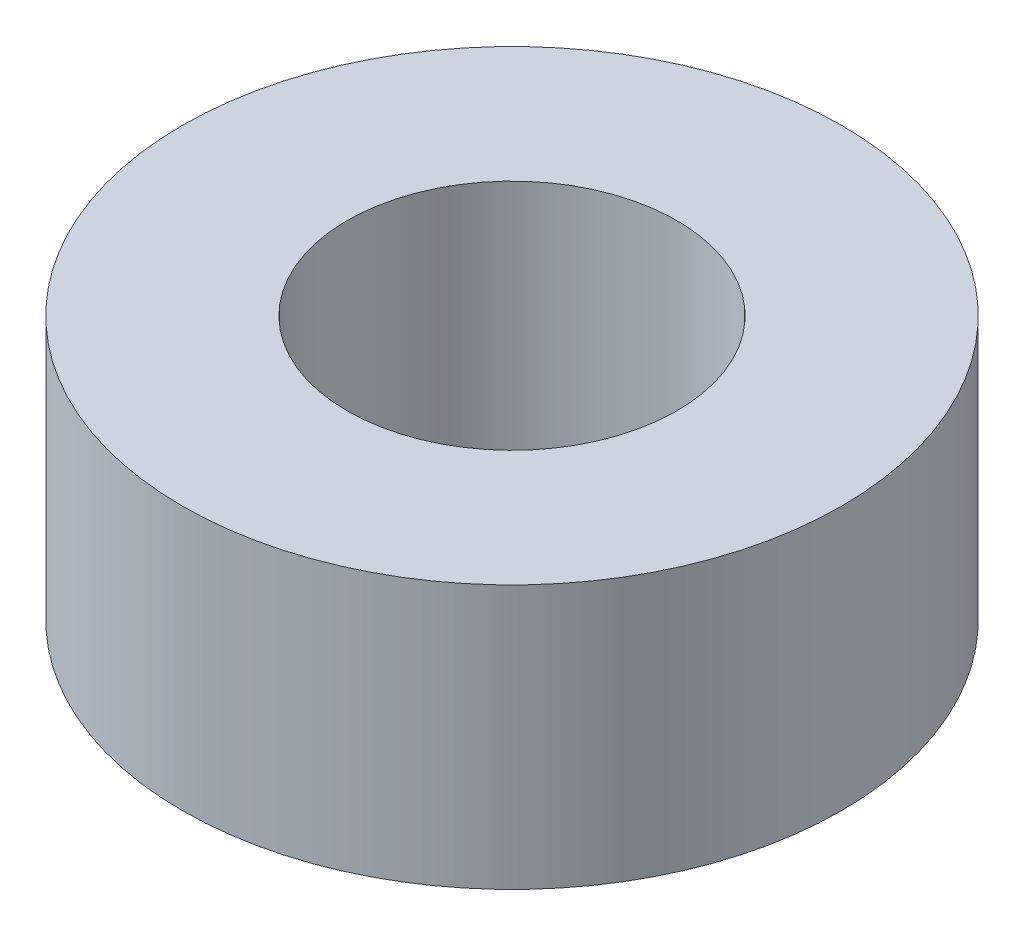
ISO-10303-21;
HEADER;
FILE_DESCRIPTION(('STEP AP214'),'2;1');
FILE_NAME('part.step','',(''),(''),'','','');
FILE_SCHEMA(('AUTOMOTIVE_DESIGN { 1 0 10303 214 1 1 1 1 }'));
ENDSEC;
DATA;
#1=APPLICATION_CONTEXT('core data for automotive mechanical design processes');
#2=APPLICATION_PROTOCOL_DEFINITION('international standard','automotive_design',2000,#1);
#3=PRODUCT_CONTEXT('',#1,'mechanical');
#4=PRODUCT('Part','Part','',(#3));
#5=PRODUCT_RELATED_PRODUCT_CATEGORY('part','',(#4));
#6=PRODUCT_DEFINITION_FORMATION('','',#4);
#7=PRODUCT_DEFINITION_CONTEXT('part definition',#1,'design');
#8=PRODUCT_DEFINITION('design','',#6,#7);
#9=PRODUCT_DEFINITION_SHAPE('','',#8);
#10=(LENGTH_UNIT() NAMED_UNIT(*) SI_UNIT(.MILLI.,.METRE.));
#11=(NAMED_UNIT(*) PLANE_ANGLE_UNIT() SI_UNIT($,.RADIAN.));
#12=(NAMED_UNIT(*) SI_UNIT($,.STERADIAN.) SOLID_ANGLE_UNIT());
#13=UNCERTAINTY_MEASURE_WITH_UNIT(LENGTH_MEASURE(1.E-05),#10,'distance_accuracy_value','');
#14=(GEOMETRIC_REPRESENTATION_CONTEXT(3) GLOBAL_UNCERTAINTY_ASSIGNED_CONTEXT((#13)) GLOBAL_UNIT_ASSIGNED_CONTEXT((#10,
#11,#12)) REPRESENTATION_CONTEXT('',''));
#15=CARTESIAN_POINT('',(0.,0.,0.));
#16=DIRECTION('',(0.,0.,1.));
#17=DIRECTION('',(1.,0.,0.));
#18=AXIS2_PLACEMENT_3D('',#15,#16,#17);
#19=CARTESIAN_POINT('',(0.,4.,0.));
#20=DIRECTION('',(0.,1.,0.));
#21=DIRECTION('',(0.,0.,1.));
#22=AXIS2_PLACEMENT_3D('',#19,#20,#21);
#23=PLANE('',#22);
#24=CARTESIAN_POINT('',(0.,4.,0.));
#25=DIRECTION('',(0.,1.,0.));
#26=DIRECTION('',(0.,0.,1.));
#27=AXIS2_PLACEMENT_3D('',#24,#25,#26);
#28=CIRCLE('',#27,5.);
#29=CARTESIAN_POINT('',(0.,4.,5.));
#30=VERTEX_POINT('',#29);
#31=EDGE_CURVE('E10',#30,#30,#28,.T.);
#32=ORIENTED_EDGE('',*,*,#31,.T.);
#33=EDGE_LOOP('',(#32));
#34=FACE_BOUND('',#33,.T.);
#35=CARTESIAN_POINT('',(0.,4.,0.));
#36=DIRECTION('',(0.,1.,0.));
#37=DIRECTION('',(0.,0.,1.));
#38=AXIS2_PLACEMENT_3D('',#35,#36,#37);
#39=CIRCLE('',#38,2.5);
#40=CARTESIAN_POINT('',(0.,4.,2.5));
#41=VERTEX_POINT('',#40);
#42=EDGE_CURVE('E44',#41,#41,#39,.T.);
#43=ORIENTED_EDGE('',*,*,#42,.F.);
#44=EDGE_LOOP('',(#43));
#45=FACE_BOUND('',#44,.T.);
#46=ADVANCED_FACE('F33',(#34,#45),#23,.T.);
#47=CARTESIAN_POINT('',(0.,0.,0.));
#48=DIRECTION('',(0.,1.,0.));
#49=DIRECTION('',(0.,0.,1.));
#50=AXIS2_PLACEMENT_3D('',#47,#48,#49);
#51=PLANE('',#50);
#52=CARTESIAN_POINT('',(0.,0.,0.));
#53=DIRECTION('',(0.,1.,0.));
#54=DIRECTION('',(0.,0.,1.));
#55=AXIS2_PLACEMENT_3D('',#52,#53,#54);
#56=CIRCLE('',#55,5.);
#57=CARTESIAN_POINT('',(0.,0.,5.));
#58=VERTEX_POINT('',#57);
#59=EDGE_CURVE('E37',#58,#58,#56,.T.);
#60=ORIENTED_EDGE('',*,*,#59,.F.);
#61=EDGE_LOOP('',(#60));
#62=FACE_BOUND('',#61,.T.);
#63=CARTESIAN_POINT('',(0.,0.,0.));
#64=DIRECTION('',(0.,1.,0.));
#65=DIRECTION('',(0.,0.,1.));
#66=AXIS2_PLACEMENT_3D('',#63,#64,#65);
#67=CIRCLE('',#66,2.5);
#68=CARTESIAN_POINT('',(0.,0.,2.5));
#69=VERTEX_POINT('',#68);
#70=EDGE_CURVE('E46',#69,#69,#67,.T.);
#71=ORIENTED_EDGE('',*,*,#70,.T.);
#72=EDGE_LOOP('',(#71));
#73=FACE_BOUND('',#72,.T.);
#74=ADVANCED_FACE('F56',(#62,#73),#51,.F.);
#75=CARTESIAN_POINT('',(0.,4.,0.));
#76=DIRECTION('',(0.,-1.,0.));
#77=DIRECTION('',(0.,0.,-1.));
#78=AXIS2_PLACEMENT_3D('',#75,#76,#77);
#79=CYLINDRICAL_SURFACE('',#78,5.);
#80=ORIENTED_EDGE('',*,*,#31,.F.);
#81=EDGE_LOOP('',(#80));
#82=FACE_BOUND('',#81,.T.);
#83=ORIENTED_EDGE('',*,*,#59,.T.);
#84=EDGE_LOOP('',(#83));
#85=FACE_BOUND('',#84,.T.);
#86=ADVANCED_FACE('F35',(#82,#85),#79,.T.);
#87=CARTESIAN_POINT('',(0.,4.,0.));
#88=DIRECTION('',(0.,-1.,0.));
#89=DIRECTION('',(0.,0.,-1.));
#90=AXIS2_PLACEMENT_3D('',#87,#88,#89);
#91=CYLINDRICAL_SURFACE('',#90,2.5);
#92=ORIENTED_EDGE('',*,*,#42,.T.);
#93=EDGE_LOOP('',(#92));
#94=FACE_BOUND('',#93,.T.);
#95=ORIENTED_EDGE('',*,*,#70,.F.);
#96=EDGE_LOOP('',(#95));
#97=FACE_BOUND('',#96,.T.);
#98=ADVANCED_FACE('F52',(#94,#97),#91,.F.);
#99=CLOSED_SHELL('',(#46,#74,#86,#98));
#100=MANIFOLD_SOLID_BREP('B2',#99);
#101=ADVANCED_BREP_SHAPE_REPRESENTATION('',(#18,#100),#14);
#102=SHAPE_DEFINITION_REPRESENTATION(#9,#101);
ENDSEC;
END-ISO-10303-21;
